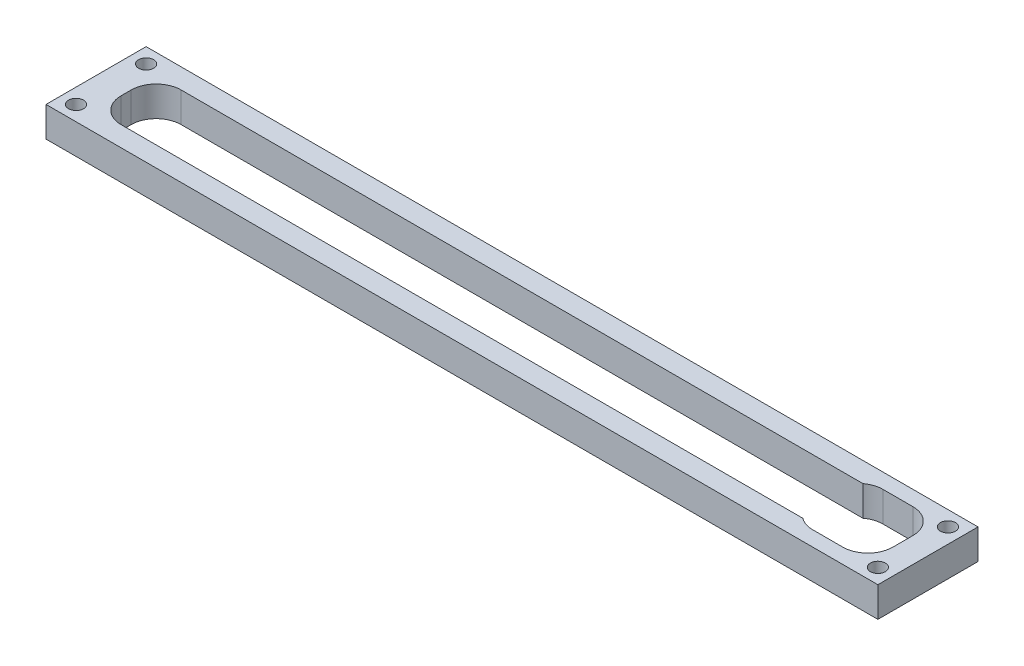
ISO-10303-21;
HEADER;
FILE_DESCRIPTION(('STEP AP214'),'2;1');
FILE_NAME('part.step','',(''),(''),'','','');
FILE_SCHEMA(('AUTOMOTIVE_DESIGN { 1 0 10303 214 1 1 1 1 }'));
ENDSEC;
DATA;
#1=APPLICATION_CONTEXT('core data for automotive mechanical design processes');
#2=APPLICATION_PROTOCOL_DEFINITION('international standard','automotive_design',2000,#1);
#3=PRODUCT_CONTEXT('',#1,'mechanical');
#4=PRODUCT('Part','Part','',(#3));
#5=PRODUCT_RELATED_PRODUCT_CATEGORY('part','',(#4));
#6=PRODUCT_DEFINITION_FORMATION('','',#4);
#7=PRODUCT_DEFINITION_CONTEXT('part definition',#1,'design');
#8=PRODUCT_DEFINITION('design','',#6,#7);
#9=PRODUCT_DEFINITION_SHAPE('','',#8);
#10=(LENGTH_UNIT() NAMED_UNIT(*) SI_UNIT(.MILLI.,.METRE.));
#11=(NAMED_UNIT(*) PLANE_ANGLE_UNIT() SI_UNIT($,.RADIAN.));
#12=(NAMED_UNIT(*) SI_UNIT($,.STERADIAN.) SOLID_ANGLE_UNIT());
#13=UNCERTAINTY_MEASURE_WITH_UNIT(LENGTH_MEASURE(1.E-05),#10,'distance_accuracy_value','');
#14=(GEOMETRIC_REPRESENTATION_CONTEXT(3) GLOBAL_UNCERTAINTY_ASSIGNED_CONTEXT((#13)) GLOBAL_UNIT_ASSIGNED_CONTEXT((#10,
#11,#12)) REPRESENTATION_CONTEXT('',''));
#15=CARTESIAN_POINT('',(0.,0.,0.));
#16=DIRECTION('',(0.,0.,1.));
#17=DIRECTION('',(1.,0.,0.));
#18=AXIS2_PLACEMENT_3D('',#15,#16,#17);
#19=CARTESIAN_POINT('',(0.,6.,0.));
#20=DIRECTION('',(0.,-1.,0.));
#21=DIRECTION('',(0.,0.,-1.));
#22=AXIS2_PLACEMENT_3D('',#19,#20,#21);
#23=PLANE('',#22);
#24=DIRECTION('',(0.,0.,1.));
#25=VECTOR('',#24,1.);
#26=CARTESIAN_POINT('',(0.,6.,0.));
#27=LINE('',#26,#25);
#28=CARTESIAN_POINT('',(0.,6.,-20.));
#29=VERTEX_POINT('',#28);
#30=CARTESIAN_POINT('',(0.,6.,0.));
#31=VERTEX_POINT('',#30);
#32=EDGE_CURVE('E250',#29,#31,#27,.T.);
#33=ORIENTED_EDGE('',*,*,#32,.T.);
#34=DIRECTION('',(1.,0.,0.));
#35=VECTOR('',#34,1.);
#36=CARTESIAN_POINT('',(0.,6.,0.));
#37=LINE('',#36,#35);
#38=CARTESIAN_POINT('',(166.159725664004,6.,0.));
#39=VERTEX_POINT('',#38);
#40=EDGE_CURVE('E253',#31,#39,#37,.T.);
#41=ORIENTED_EDGE('',*,*,#40,.T.);
#42=DIRECTION('',(0.,0.,-1.));
#43=VECTOR('',#42,1.);
#44=CARTESIAN_POINT('',(166.159725664004,6.,0.));
#45=LINE('',#44,#43);
#46=CARTESIAN_POINT('',(166.159725664004,6.,-20.));
#47=VERTEX_POINT('',#46);
#48=EDGE_CURVE('E256',#39,#47,#45,.T.);
#49=ORIENTED_EDGE('',*,*,#48,.T.);
#50=DIRECTION('',(-1.,0.,0.));
#51=VECTOR('',#50,1.);
#52=CARTESIAN_POINT('',(0.,6.,-20.));
#53=LINE('',#52,#51);
#54=EDGE_CURVE('E258',#47,#29,#53,.T.);
#55=ORIENTED_EDGE('',*,*,#54,.T.);
#56=EDGE_LOOP('',(#33,#41,#49,#55));
#57=FACE_BOUND('',#56,.T.);
#58=DIRECTION('',(-1.,0.,0.));
#59=VECTOR('',#58,1.);
#60=CARTESIAN_POINT('',(5.99999999999999,6.,-16.));
#61=LINE('',#60,#59);
#62=CARTESIAN_POINT('',(147.159725664004,6.,-16.));
#63=VERTEX_POINT('',#62);
#64=CARTESIAN_POINT('',(11.,6.,-16.));
#65=VERTEX_POINT('',#64);
#66=EDGE_CURVE('E243',#63,#65,#61,.T.);
#67=ORIENTED_EDGE('',*,*,#66,.F.);
#68=CARTESIAN_POINT('',(150.159725664004,6.,-12.));
#69=DIRECTION('',(0.,-1.,0.));
#70=DIRECTION('',(0.,0.,-1.));
#71=AXIS2_PLACEMENT_3D('',#68,#69,#70);
#72=CIRCLE('',#71,5.);
#73=CARTESIAN_POINT('',(150.159725664004,6.,-17.));
#74=VERTEX_POINT('',#73);
#75=EDGE_CURVE('E193',#63,#74,#72,.T.);
#76=ORIENTED_EDGE('',*,*,#75,.T.);
#77=DIRECTION('',(-1.,0.,0.));
#78=VECTOR('',#77,1.);
#79=CARTESIAN_POINT('',(147.159725664004,6.,-17.));
#80=LINE('',#79,#78);
#81=CARTESIAN_POINT('',(156.159725664004,6.,-17.));
#82=VERTEX_POINT('',#81);
#83=EDGE_CURVE('E205',#82,#74,#80,.T.);
#84=ORIENTED_EDGE('',*,*,#83,.F.);
#85=CARTESIAN_POINT('',(156.159725664004,6.,-12.));
#86=DIRECTION('',(0.,-1.,0.));
#87=DIRECTION('',(0.,0.,-1.));
#88=AXIS2_PLACEMENT_3D('',#85,#86,#87);
#89=CIRCLE('',#88,5.);
#90=CARTESIAN_POINT('',(161.159725664004,6.,-12.));
#91=VERTEX_POINT('',#90);
#92=EDGE_CURVE('E185',#82,#91,#89,.T.);
#93=ORIENTED_EDGE('',*,*,#92,.T.);
#94=DIRECTION('',(0.,0.,-1.));
#95=VECTOR('',#94,1.);
#96=CARTESIAN_POINT('',(161.159725664004,6.,-17.));
#97=LINE('',#96,#95);
#98=CARTESIAN_POINT('',(161.159725664004,6.,-8.00000000000001));
#99=VERTEX_POINT('',#98);
#100=EDGE_CURVE('E202',#99,#91,#97,.T.);
#101=ORIENTED_EDGE('',*,*,#100,.F.);
#102=CARTESIAN_POINT('',(156.159725664004,6.,-8.00000000000001));
#103=DIRECTION('',(0.,-1.,0.));
#104=DIRECTION('',(0.,0.,-1.));
#105=AXIS2_PLACEMENT_3D('',#102,#103,#104);
#106=CIRCLE('',#105,5.);
#107=CARTESIAN_POINT('',(156.159725664004,6.,-3.00000000000001));
#108=VERTEX_POINT('',#107);
#109=EDGE_CURVE('E189',#99,#108,#106,.T.);
#110=ORIENTED_EDGE('',*,*,#109,.T.);
#111=DIRECTION('',(1.,0.,0.));
#112=VECTOR('',#111,1.);
#113=CARTESIAN_POINT('',(147.159725664004,6.,-3.));
#114=LINE('',#113,#112);
#115=CARTESIAN_POINT('',(150.159725664004,6.,-3.));
#116=VERTEX_POINT('',#115);
#117=EDGE_CURVE('E200',#116,#108,#114,.T.);
#118=ORIENTED_EDGE('',*,*,#117,.F.);
#119=CARTESIAN_POINT('',(150.159725664004,6.,-8.00000000000001));
#120=DIRECTION('',(0.,-1.,0.));
#121=DIRECTION('',(0.,0.,-1.));
#122=AXIS2_PLACEMENT_3D('',#119,#120,#121);
#123=CIRCLE('',#122,5.);
#124=CARTESIAN_POINT('',(147.159725664004,6.,-4.00000000000002));
#125=VERTEX_POINT('',#124);
#126=EDGE_CURVE('E43',#116,#125,#123,.T.);
#127=ORIENTED_EDGE('',*,*,#126,.T.);
#128=DIRECTION('',(1.,0.,0.));
#129=VECTOR('',#128,1.);
#130=CARTESIAN_POINT('',(5.99999999999999,6.,-4.00000000000002));
#131=LINE('',#130,#129);
#132=CARTESIAN_POINT('',(11.,6.,-4.00000000000002));
#133=VERTEX_POINT('',#132);
#134=EDGE_CURVE('E162',#133,#125,#131,.T.);
#135=ORIENTED_EDGE('',*,*,#134,.F.);
#136=CARTESIAN_POINT('',(11.,6.,-9.00000000000001));
#137=DIRECTION('',(0.,-1.,0.));
#138=DIRECTION('',(0.,0.,-1.));
#139=AXIS2_PLACEMENT_3D('',#136,#137,#138);
#140=CIRCLE('',#139,5.);
#141=CARTESIAN_POINT('',(5.99999999999999,6.,-9.00000000000001));
#142=VERTEX_POINT('',#141);
#143=EDGE_CURVE('E179',#133,#142,#140,.T.);
#144=ORIENTED_EDGE('',*,*,#143,.T.);
#145=DIRECTION('',(0.,0.,1.));
#146=VECTOR('',#145,1.);
#147=CARTESIAN_POINT('',(5.99999999999999,6.,-16.));
#148=LINE('',#147,#146);
#149=CARTESIAN_POINT('',(5.99999999999999,6.,-11.));
#150=VERTEX_POINT('',#149);
#151=EDGE_CURVE('E239',#150,#142,#148,.T.);
#152=ORIENTED_EDGE('',*,*,#151,.F.);
#153=CARTESIAN_POINT('',(11.,6.,-11.));
#154=DIRECTION('',(0.,-1.,0.));
#155=DIRECTION('',(0.,0.,-1.));
#156=AXIS2_PLACEMENT_3D('',#153,#154,#155);
#157=CIRCLE('',#156,5.);
#158=EDGE_CURVE('E183',#150,#65,#157,.T.);
#159=ORIENTED_EDGE('',*,*,#158,.T.);
#160=EDGE_LOOP('',(#67,#76,#84,#93,#101,#110,#118,#127,#135,#144,#152,#159));
#161=FACE_BOUND('',#160,.T.);
#162=CARTESIAN_POINT('',(3.,6.,-17.));
#163=DIRECTION('',(0.,1.,0.));
#164=DIRECTION('',(0.,0.,1.));
#165=AXIS2_PLACEMENT_3D('',#162,#163,#164);
#166=CIRCLE('',#165,1.5);
#167=CARTESIAN_POINT('',(3.,6.,-15.5));
#168=VERTEX_POINT('',#167);
#169=EDGE_CURVE('E234',#168,#168,#166,.T.);
#170=ORIENTED_EDGE('',*,*,#169,.F.);
#171=EDGE_LOOP('',(#170));
#172=FACE_BOUND('',#171,.T.);
#173=CARTESIAN_POINT('',(3.,6.,-3.));
#174=DIRECTION('',(0.,1.,0.));
#175=DIRECTION('',(0.,0.,-1.));
#176=AXIS2_PLACEMENT_3D('',#173,#174,#175);
#177=CIRCLE('',#176,1.5);
#178=CARTESIAN_POINT('',(3.,6.,-4.5));
#179=VERTEX_POINT('',#178);
#180=EDGE_CURVE('E228',#179,#179,#177,.T.);
#181=ORIENTED_EDGE('',*,*,#180,.F.);
#182=EDGE_LOOP('',(#181));
#183=FACE_BOUND('',#182,.T.);
#184=CARTESIAN_POINT('',(163.159725664004,6.,-3.00000000000002));
#185=DIRECTION('',(0.,1.,0.));
#186=DIRECTION('',(0.,0.,1.));
#187=AXIS2_PLACEMENT_3D('',#184,#185,#186);
#188=CIRCLE('',#187,1.5);
#189=CARTESIAN_POINT('',(163.159725664004,6.,-1.50000000000002));
#190=VERTEX_POINT('',#189);
#191=EDGE_CURVE('E222',#190,#190,#188,.T.);
#192=ORIENTED_EDGE('',*,*,#191,.F.);
#193=EDGE_LOOP('',(#192));
#194=FACE_BOUND('',#193,.T.);
#195=CARTESIAN_POINT('',(163.159725664004,6.,-17.0000000000001));
#196=DIRECTION('',(0.,1.,0.));
#197=DIRECTION('',(0.,0.,-1.));
#198=AXIS2_PLACEMENT_3D('',#195,#196,#197);
#199=CIRCLE('',#198,1.5);
#200=CARTESIAN_POINT('',(163.159725664004,6.,-18.5000000000001));
#201=VERTEX_POINT('',#200);
#202=EDGE_CURVE('E216',#201,#201,#199,.T.);
#203=ORIENTED_EDGE('',*,*,#202,.F.);
#204=EDGE_LOOP('',(#203));
#205=FACE_BOUND('',#204,.T.);
#206=ADVANCED_FACE('F35',(#57,#161,#172,#183,#194,#205),#23,.F.);
#207=CARTESIAN_POINT('',(0.,0.,0.));
#208=DIRECTION('',(0.,-1.,0.));
#209=DIRECTION('',(0.,0.,-1.));
#210=AXIS2_PLACEMENT_3D('',#207,#208,#209);
#211=PLANE('',#210);
#212=DIRECTION('',(-1.,0.,0.));
#213=VECTOR('',#212,1.);
#214=CARTESIAN_POINT('',(147.159725664004,0.,-17.));
#215=LINE('',#214,#213);
#216=CARTESIAN_POINT('',(156.159725664004,0.,-17.));
#217=VERTEX_POINT('',#216);
#218=CARTESIAN_POINT('',(150.159725664004,0.,-17.));
#219=VERTEX_POINT('',#218);
#220=EDGE_CURVE('E165',#217,#219,#215,.T.);
#221=ORIENTED_EDGE('',*,*,#220,.T.);
#222=CARTESIAN_POINT('',(150.159725664004,0.,-12.));
#223=DIRECTION('',(0.,-1.,0.));
#224=DIRECTION('',(0.,0.,-1.));
#225=AXIS2_PLACEMENT_3D('',#222,#223,#224);
#226=CIRCLE('',#225,5.);
#227=CARTESIAN_POINT('',(147.159725664004,0.,-16.));
#228=VERTEX_POINT('',#227);
#229=EDGE_CURVE('E195',#219,#228,#226,.F.);
#230=ORIENTED_EDGE('',*,*,#229,.T.);
#231=DIRECTION('',(-1.,0.,0.));
#232=VECTOR('',#231,1.);
#233=CARTESIAN_POINT('',(5.99999999999999,0.,-16.));
#234=LINE('',#233,#232);
#235=CARTESIAN_POINT('',(11.,0.,-16.));
#236=VERTEX_POINT('',#235);
#237=EDGE_CURVE('E154',#228,#236,#234,.T.);
#238=ORIENTED_EDGE('',*,*,#237,.T.);
#239=CARTESIAN_POINT('',(11.,0.,-11.));
#240=DIRECTION('',(0.,-1.,0.));
#241=DIRECTION('',(0.,0.,-1.));
#242=AXIS2_PLACEMENT_3D('',#239,#240,#241);
#243=CIRCLE('',#242,5.);
#244=CARTESIAN_POINT('',(5.99999999999999,0.,-11.));
#245=VERTEX_POINT('',#244);
#246=EDGE_CURVE('E181',#236,#245,#243,.F.);
#247=ORIENTED_EDGE('',*,*,#246,.T.);
#248=DIRECTION('',(0.,0.,1.));
#249=VECTOR('',#248,1.);
#250=CARTESIAN_POINT('',(5.99999999999999,0.,-16.));
#251=LINE('',#250,#249);
#252=CARTESIAN_POINT('',(5.99999999999999,0.,-9.00000000000001));
#253=VERTEX_POINT('',#252);
#254=EDGE_CURVE('E155',#245,#253,#251,.T.);
#255=ORIENTED_EDGE('',*,*,#254,.T.);
#256=CARTESIAN_POINT('',(11.,0.,-9.00000000000001));
#257=DIRECTION('',(0.,-1.,0.));
#258=DIRECTION('',(0.,0.,-1.));
#259=AXIS2_PLACEMENT_3D('',#256,#257,#258);
#260=CIRCLE('',#259,5.);
#261=CARTESIAN_POINT('',(11.,0.,-4.00000000000002));
#262=VERTEX_POINT('',#261);
#263=EDGE_CURVE('E151',#253,#262,#260,.F.);
#264=ORIENTED_EDGE('',*,*,#263,.T.);
#265=DIRECTION('',(1.,0.,0.));
#266=VECTOR('',#265,1.);
#267=CARTESIAN_POINT('',(5.99999999999999,0.,-4.00000000000002));
#268=LINE('',#267,#266);
#269=CARTESIAN_POINT('',(147.159725664004,0.,-4.00000000000002));
#270=VERTEX_POINT('',#269);
#271=EDGE_CURVE('E145',#262,#270,#268,.T.);
#272=ORIENTED_EDGE('',*,*,#271,.T.);
#273=CARTESIAN_POINT('',(150.159725664004,0.,-8.00000000000001));
#274=DIRECTION('',(0.,-1.,0.));
#275=DIRECTION('',(0.,0.,-1.));
#276=AXIS2_PLACEMENT_3D('',#273,#274,#275);
#277=CIRCLE('',#276,5.);
#278=CARTESIAN_POINT('',(150.159725664004,0.,-3.));
#279=VERTEX_POINT('',#278);
#280=EDGE_CURVE('E11',#270,#279,#277,.F.);
#281=ORIENTED_EDGE('',*,*,#280,.T.);
#282=DIRECTION('',(1.,0.,0.));
#283=VECTOR('',#282,1.);
#284=CARTESIAN_POINT('',(147.159725664004,0.,-3.));
#285=LINE('',#284,#283);
#286=CARTESIAN_POINT('',(156.159725664004,0.,-3.00000000000001));
#287=VERTEX_POINT('',#286);
#288=EDGE_CURVE('E212',#279,#287,#285,.T.);
#289=ORIENTED_EDGE('',*,*,#288,.T.);
#290=CARTESIAN_POINT('',(156.159725664004,0.,-8.00000000000001));
#291=DIRECTION('',(0.,-1.,0.));
#292=DIRECTION('',(0.,0.,-1.));
#293=AXIS2_PLACEMENT_3D('',#290,#291,#292);
#294=CIRCLE('',#293,5.);
#295=CARTESIAN_POINT('',(161.159725664004,0.,-8.00000000000001));
#296=VERTEX_POINT('',#295);
#297=EDGE_CURVE('E191',#287,#296,#294,.F.);
#298=ORIENTED_EDGE('',*,*,#297,.T.);
#299=DIRECTION('',(0.,0.,-1.));
#300=VECTOR('',#299,1.);
#301=CARTESIAN_POINT('',(161.159725664004,0.,-17.));
#302=LINE('',#301,#300);
#303=CARTESIAN_POINT('',(161.159725664004,0.,-12.));
#304=VERTEX_POINT('',#303);
#305=EDGE_CURVE('E300',#296,#304,#302,.T.);
#306=ORIENTED_EDGE('',*,*,#305,.T.);
#307=CARTESIAN_POINT('',(156.159725664004,0.,-12.));
#308=DIRECTION('',(0.,-1.,0.));
#309=DIRECTION('',(0.,0.,-1.));
#310=AXIS2_PLACEMENT_3D('',#307,#308,#309);
#311=CIRCLE('',#310,5.);
#312=EDGE_CURVE('E187',#304,#217,#311,.F.);
#313=ORIENTED_EDGE('',*,*,#312,.T.);
#314=EDGE_LOOP('',(#221,#230,#238,#247,#255,#264,#272,#281,#289,#298,#306,#313));
#315=FACE_BOUND('',#314,.T.);
#316=CARTESIAN_POINT('',(163.159725664004,0.,-3.00000000000002));
#317=DIRECTION('',(0.,1.,0.));
#318=DIRECTION('',(0.,0.,1.));
#319=AXIS2_PLACEMENT_3D('',#316,#317,#318);
#320=CIRCLE('',#319,1.5);
#321=CARTESIAN_POINT('',(163.159725664004,0.,-1.50000000000002));
#322=VERTEX_POINT('',#321);
#323=EDGE_CURVE('E219',#322,#322,#320,.T.);
#324=ORIENTED_EDGE('',*,*,#323,.T.);
#325=EDGE_LOOP('',(#324));
#326=FACE_BOUND('',#325,.T.);
#327=CARTESIAN_POINT('',(3.,0.,-17.));
#328=DIRECTION('',(0.,1.,0.));
#329=DIRECTION('',(0.,0.,1.));
#330=AXIS2_PLACEMENT_3D('',#327,#328,#329);
#331=CIRCLE('',#330,1.5);
#332=CARTESIAN_POINT('',(3.,0.,-15.5));
#333=VERTEX_POINT('',#332);
#334=EDGE_CURVE('E231',#333,#333,#331,.T.);
#335=ORIENTED_EDGE('',*,*,#334,.T.);
#336=EDGE_LOOP('',(#335));
#337=FACE_BOUND('',#336,.T.);
#338=DIRECTION('',(0.,0.,1.));
#339=VECTOR('',#338,1.);
#340=CARTESIAN_POINT('',(0.,0.,0.));
#341=LINE('',#340,#339);
#342=CARTESIAN_POINT('',(0.,0.,-20.));
#343=VERTEX_POINT('',#342);
#344=CARTESIAN_POINT('',(0.,0.,0.));
#345=VERTEX_POINT('',#344);
#346=EDGE_CURVE('E246',#343,#345,#341,.T.);
#347=ORIENTED_EDGE('',*,*,#346,.F.);
#348=DIRECTION('',(-1.,0.,0.));
#349=VECTOR('',#348,1.);
#350=CARTESIAN_POINT('',(0.,0.,-20.));
#351=LINE('',#350,#349);
#352=CARTESIAN_POINT('',(166.159725664004,0.,-20.));
#353=VERTEX_POINT('',#352);
#354=EDGE_CURVE('E254',#353,#343,#351,.T.);
#355=ORIENTED_EDGE('',*,*,#354,.F.);
#356=DIRECTION('',(0.,0.,-1.));
#357=VECTOR('',#356,1.);
#358=CARTESIAN_POINT('',(166.159725664004,0.,0.));
#359=LINE('',#358,#357);
#360=CARTESIAN_POINT('',(166.159725664004,0.,0.));
#361=VERTEX_POINT('',#360);
#362=EDGE_CURVE('E265',#361,#353,#359,.T.);
#363=ORIENTED_EDGE('',*,*,#362,.F.);
#364=DIRECTION('',(1.,0.,0.));
#365=VECTOR('',#364,1.);
#366=CARTESIAN_POINT('',(0.,0.,0.));
#367=LINE('',#366,#365);
#368=EDGE_CURVE('E263',#345,#361,#367,.T.);
#369=ORIENTED_EDGE('',*,*,#368,.F.);
#370=EDGE_LOOP('',(#347,#355,#363,#369));
#371=FACE_BOUND('',#370,.T.);
#372=CARTESIAN_POINT('',(3.,0.,-3.));
#373=DIRECTION('',(0.,1.,0.));
#374=DIRECTION('',(0.,0.,-1.));
#375=AXIS2_PLACEMENT_3D('',#372,#373,#374);
#376=CIRCLE('',#375,1.5);
#377=CARTESIAN_POINT('',(3.,0.,-4.5));
#378=VERTEX_POINT('',#377);
#379=EDGE_CURVE('E225',#378,#378,#376,.T.);
#380=ORIENTED_EDGE('',*,*,#379,.T.);
#381=EDGE_LOOP('',(#380));
#382=FACE_BOUND('',#381,.T.);
#383=CARTESIAN_POINT('',(163.159725664004,0.,-17.0000000000001));
#384=DIRECTION('',(0.,1.,0.));
#385=DIRECTION('',(0.,0.,-1.));
#386=AXIS2_PLACEMENT_3D('',#383,#384,#385);
#387=CIRCLE('',#386,1.5);
#388=CARTESIAN_POINT('',(163.159725664004,0.,-18.5000000000001));
#389=VERTEX_POINT('',#388);
#390=EDGE_CURVE('E214',#389,#389,#387,.T.);
#391=ORIENTED_EDGE('',*,*,#390,.T.);
#392=EDGE_LOOP('',(#391));
#393=FACE_BOUND('',#392,.T.);
#394=ADVANCED_FACE('F148',(#315,#326,#337,#371,#382,#393),#211,.T.);
#395=CARTESIAN_POINT('',(0.,6.,0.));
#396=DIRECTION('',(1.,0.,0.));
#397=DIRECTION('',(0.,0.,-1.));
#398=AXIS2_PLACEMENT_3D('',#395,#396,#397);
#399=PLANE('',#398);
#400=ORIENTED_EDGE('',*,*,#346,.T.);
#401=DIRECTION('',(0.,-1.,0.));
#402=VECTOR('',#401,1.);
#403=CARTESIAN_POINT('',(0.,6.,0.));
#404=LINE('',#403,#402);
#405=EDGE_CURVE('E276',#31,#345,#404,.T.);
#406=ORIENTED_EDGE('',*,*,#405,.F.);
#407=ORIENTED_EDGE('',*,*,#32,.F.);
#408=DIRECTION('',(0.,-1.,0.));
#409=VECTOR('',#408,1.);
#410=CARTESIAN_POINT('',(0.,6.,-20.));
#411=LINE('',#410,#409);
#412=EDGE_CURVE('E260',#29,#343,#411,.T.);
#413=ORIENTED_EDGE('',*,*,#412,.T.);
#414=EDGE_LOOP('',(#400,#406,#407,#413));
#415=FACE_BOUND('',#414,.T.);
#416=ADVANCED_FACE('F331',(#415),#399,.F.);
#417=CARTESIAN_POINT('',(0.,6.,0.));
#418=DIRECTION('',(0.,0.,-1.));
#419=DIRECTION('',(-1.,0.,0.));
#420=AXIS2_PLACEMENT_3D('',#417,#418,#419);
#421=PLANE('',#420);
#422=ORIENTED_EDGE('',*,*,#368,.T.);
#423=DIRECTION('',(0.,-1.,0.));
#424=VECTOR('',#423,1.);
#425=CARTESIAN_POINT('',(166.159725664004,6.,0.));
#426=LINE('',#425,#424);
#427=EDGE_CURVE('E273',#39,#361,#426,.T.);
#428=ORIENTED_EDGE('',*,*,#427,.F.);
#429=ORIENTED_EDGE('',*,*,#40,.F.);
#430=ORIENTED_EDGE('',*,*,#405,.T.);
#431=EDGE_LOOP('',(#422,#428,#429,#430));
#432=FACE_BOUND('',#431,.T.);
#433=ADVANCED_FACE('F344',(#432),#421,.F.);
#434=CARTESIAN_POINT('',(166.159725664004,6.,0.));
#435=DIRECTION('',(-1.,0.,0.));
#436=DIRECTION('',(0.,0.,1.));
#437=AXIS2_PLACEMENT_3D('',#434,#435,#436);
#438=PLANE('',#437);
#439=ORIENTED_EDGE('',*,*,#362,.T.);
#440=DIRECTION('',(0.,-1.,0.));
#441=VECTOR('',#440,1.);
#442=CARTESIAN_POINT('',(166.159725664004,6.,-20.));
#443=LINE('',#442,#441);
#444=EDGE_CURVE('E270',#47,#353,#443,.T.);
#445=ORIENTED_EDGE('',*,*,#444,.F.);
#446=ORIENTED_EDGE('',*,*,#48,.F.);
#447=ORIENTED_EDGE('',*,*,#427,.T.);
#448=EDGE_LOOP('',(#439,#445,#446,#447));
#449=FACE_BOUND('',#448,.T.);
#450=ADVANCED_FACE('F340',(#449),#438,.F.);
#451=CARTESIAN_POINT('',(0.,6.,-20.));
#452=DIRECTION('',(0.,0.,1.));
#453=DIRECTION('',(1.,0.,0.));
#454=AXIS2_PLACEMENT_3D('',#451,#452,#453);
#455=PLANE('',#454);
#456=ORIENTED_EDGE('',*,*,#354,.T.);
#457=ORIENTED_EDGE('',*,*,#412,.F.);
#458=ORIENTED_EDGE('',*,*,#54,.F.);
#459=ORIENTED_EDGE('',*,*,#444,.T.);
#460=EDGE_LOOP('',(#456,#457,#458,#459));
#461=FACE_BOUND('',#460,.T.);
#462=ADVANCED_FACE('F337',(#461),#455,.F.);
#463=CARTESIAN_POINT('',(5.99999999999999,6.,-16.));
#464=DIRECTION('',(1.,0.,0.));
#465=DIRECTION('',(0.,0.,-1.));
#466=AXIS2_PLACEMENT_3D('',#463,#464,#465);
#467=PLANE('',#466);
#468=ORIENTED_EDGE('',*,*,#151,.T.);
#469=DIRECTION('',(0.,-1.,0.));
#470=VECTOR('',#469,1.);
#471=CARTESIAN_POINT('',(5.99999999999999,0.,-9.00000000000001));
#472=LINE('',#471,#470);
#473=EDGE_CURVE('E281',#142,#253,#472,.T.);
#474=ORIENTED_EDGE('',*,*,#473,.T.);
#475=ORIENTED_EDGE('',*,*,#254,.F.);
#476=DIRECTION('',(0.,-1.,0.));
#477=VECTOR('',#476,1.);
#478=CARTESIAN_POINT('',(5.99999999999999,6.,-11.));
#479=LINE('',#478,#477);
#480=EDGE_CURVE('E279',#245,#150,#479,.F.);
#481=ORIENTED_EDGE('',*,*,#480,.T.);
#482=EDGE_LOOP('',(#468,#474,#475,#481));
#483=FACE_BOUND('',#482,.T.);
#484=ADVANCED_FACE('F334',(#483),#467,.T.);
#485=CARTESIAN_POINT('',(5.99999999999999,6.,-4.00000000000002));
#486=DIRECTION('',(0.,0.,-1.));
#487=DIRECTION('',(-1.,0.,0.));
#488=AXIS2_PLACEMENT_3D('',#485,#486,#487);
#489=PLANE('',#488);
#490=ORIENTED_EDGE('',*,*,#271,.F.);
#491=DIRECTION('',(0.,-1.,0.));
#492=VECTOR('',#491,1.);
#493=CARTESIAN_POINT('',(11.,6.,-4.00000000000002));
#494=LINE('',#493,#492);
#495=EDGE_CURVE('E284',#262,#133,#494,.F.);
#496=ORIENTED_EDGE('',*,*,#495,.T.);
#497=ORIENTED_EDGE('',*,*,#134,.T.);
#498=DIRECTION('',(0.,1.,0.));
#499=VECTOR('',#498,1.);
#500=CARTESIAN_POINT('',(147.159725664004,0.,-4.00000000000002));
#501=LINE('',#500,#499);
#502=EDGE_CURVE('E159',#270,#125,#501,.T.);
#503=ORIENTED_EDGE('',*,*,#502,.F.);
#504=EDGE_LOOP('',(#490,#496,#497,#503));
#505=FACE_BOUND('',#504,.T.);
#506=ADVANCED_FACE('F160',(#505),#489,.T.);
#507=CARTESIAN_POINT('',(5.99999999999999,6.,-16.));
#508=DIRECTION('',(0.,0.,1.));
#509=DIRECTION('',(1.,0.,0.));
#510=AXIS2_PLACEMENT_3D('',#507,#508,#509);
#511=PLANE('',#510);
#512=ORIENTED_EDGE('',*,*,#66,.T.);
#513=DIRECTION('',(0.,-1.,0.));
#514=VECTOR('',#513,1.);
#515=CARTESIAN_POINT('',(11.,0.,-16.));
#516=LINE('',#515,#514);
#517=EDGE_CURVE('E286',#65,#236,#516,.T.);
#518=ORIENTED_EDGE('',*,*,#517,.T.);
#519=ORIENTED_EDGE('',*,*,#237,.F.);
#520=DIRECTION('',(0.,1.,0.));
#521=VECTOR('',#520,1.);
#522=CARTESIAN_POINT('',(147.159725664004,0.,-16.));
#523=LINE('',#522,#521);
#524=EDGE_CURVE('E164',#228,#63,#523,.T.);
#525=ORIENTED_EDGE('',*,*,#524,.T.);
#526=EDGE_LOOP('',(#512,#518,#519,#525));
#527=FACE_BOUND('',#526,.T.);
#528=ADVANCED_FACE('F366',(#527),#511,.T.);
#529=CARTESIAN_POINT('',(3.,6.,-17.));
#530=DIRECTION('',(0.,-1.,0.));
#531=DIRECTION('',(0.,0.,-1.));
#532=AXIS2_PLACEMENT_3D('',#529,#530,#531);
#533=CYLINDRICAL_SURFACE('',#532,1.5);
#534=ORIENTED_EDGE('',*,*,#169,.T.);
#535=EDGE_LOOP('',(#534));
#536=FACE_BOUND('',#535,.T.);
#537=ORIENTED_EDGE('',*,*,#334,.F.);
#538=EDGE_LOOP('',(#537));
#539=FACE_BOUND('',#538,.T.);
#540=ADVANCED_FACE('F379',(#536,#539),#533,.F.);
#541=CARTESIAN_POINT('',(3.,6.,-3.));
#542=DIRECTION('',(0.,-1.,0.));
#543=DIRECTION('',(0.,0.,-1.));
#544=AXIS2_PLACEMENT_3D('',#541,#542,#543);
#545=CYLINDRICAL_SURFACE('',#544,1.5);
#546=ORIENTED_EDGE('',*,*,#180,.T.);
#547=EDGE_LOOP('',(#546));
#548=FACE_BOUND('',#547,.T.);
#549=ORIENTED_EDGE('',*,*,#379,.F.);
#550=EDGE_LOOP('',(#549));
#551=FACE_BOUND('',#550,.T.);
#552=ADVANCED_FACE('F384',(#548,#551),#545,.F.);
#553=CARTESIAN_POINT('',(163.159725664004,6.,-3.00000000000002));
#554=DIRECTION('',(0.,-1.,0.));
#555=DIRECTION('',(0.,0.,-1.));
#556=AXIS2_PLACEMENT_3D('',#553,#554,#555);
#557=CYLINDRICAL_SURFACE('',#556,1.5);
#558=ORIENTED_EDGE('',*,*,#191,.T.);
#559=EDGE_LOOP('',(#558));
#560=FACE_BOUND('',#559,.T.);
#561=ORIENTED_EDGE('',*,*,#323,.F.);
#562=EDGE_LOOP('',(#561));
#563=FACE_BOUND('',#562,.T.);
#564=ADVANCED_FACE('F388',(#560,#563),#557,.F.);
#565=CARTESIAN_POINT('',(163.159725664004,6.,-17.0000000000001));
#566=DIRECTION('',(0.,-1.,0.));
#567=DIRECTION('',(0.,0.,-1.));
#568=AXIS2_PLACEMENT_3D('',#565,#566,#567);
#569=CYLINDRICAL_SURFACE('',#568,1.5);
#570=ORIENTED_EDGE('',*,*,#202,.T.);
#571=EDGE_LOOP('',(#570));
#572=FACE_BOUND('',#571,.T.);
#573=ORIENTED_EDGE('',*,*,#390,.F.);
#574=EDGE_LOOP('',(#573));
#575=FACE_BOUND('',#574,.T.);
#576=ADVANCED_FACE('F392',(#572,#575),#569,.F.);
#577=CARTESIAN_POINT('',(147.159725664004,0.,-17.));
#578=DIRECTION('',(0.,0.,-1.));
#579=DIRECTION('',(-1.,0.,0.));
#580=AXIS2_PLACEMENT_3D('',#577,#578,#579);
#581=PLANE('',#580);
#582=ORIENTED_EDGE('',*,*,#220,.F.);
#583=DIRECTION('',(0.,1.,0.));
#584=VECTOR('',#583,1.);
#585=CARTESIAN_POINT('',(156.159725664004,6.,-17.));
#586=LINE('',#585,#584);
#587=EDGE_CURVE('E291',#217,#82,#586,.T.);
#588=ORIENTED_EDGE('',*,*,#587,.T.);
#589=ORIENTED_EDGE('',*,*,#83,.T.);
#590=DIRECTION('',(0.,1.,0.));
#591=VECTOR('',#590,1.);
#592=CARTESIAN_POINT('',(150.159725664004,0.,-17.));
#593=LINE('',#592,#591);
#594=EDGE_CURVE('E289',#74,#219,#593,.F.);
#595=ORIENTED_EDGE('',*,*,#594,.T.);
#596=EDGE_LOOP('',(#582,#588,#589,#595));
#597=FACE_BOUND('',#596,.T.);
#598=ADVANCED_FACE('F310',(#597),#581,.F.);
#599=CARTESIAN_POINT('',(161.159725664004,0.,-17.));
#600=DIRECTION('',(1.,0.,0.));
#601=DIRECTION('',(0.,0.,-1.));
#602=AXIS2_PLACEMENT_3D('',#599,#600,#601);
#603=PLANE('',#602);
#604=ORIENTED_EDGE('',*,*,#100,.T.);
#605=DIRECTION('',(0.,1.,0.));
#606=VECTOR('',#605,1.);
#607=CARTESIAN_POINT('',(161.159725664004,0.,-12.));
#608=LINE('',#607,#606);
#609=EDGE_CURVE('E171',#91,#304,#608,.F.);
#610=ORIENTED_EDGE('',*,*,#609,.T.);
#611=ORIENTED_EDGE('',*,*,#305,.F.);
#612=DIRECTION('',(0.,1.,0.));
#613=VECTOR('',#612,1.);
#614=CARTESIAN_POINT('',(161.159725664004,6.,-8.00000000000001));
#615=LINE('',#614,#613);
#616=EDGE_CURVE('E174',#296,#99,#615,.T.);
#617=ORIENTED_EDGE('',*,*,#616,.T.);
#618=EDGE_LOOP('',(#604,#610,#611,#617));
#619=FACE_BOUND('',#618,.T.);
#620=ADVANCED_FACE('F297',(#619),#603,.F.);
#621=CARTESIAN_POINT('',(147.159725664004,0.,-3.));
#622=DIRECTION('',(0.,0.,1.));
#623=DIRECTION('',(1.,0.,0.));
#624=AXIS2_PLACEMENT_3D('',#621,#622,#623);
#625=PLANE('',#624);
#626=ORIENTED_EDGE('',*,*,#117,.T.);
#627=DIRECTION('',(0.,1.,0.));
#628=VECTOR('',#627,1.);
#629=CARTESIAN_POINT('',(156.159725664004,0.,-3.00000000000001));
#630=LINE('',#629,#628);
#631=EDGE_CURVE('E50',#108,#287,#630,.F.);
#632=ORIENTED_EDGE('',*,*,#631,.T.);
#633=ORIENTED_EDGE('',*,*,#288,.F.);
#634=DIRECTION('',(0.,-1.,0.));
#635=VECTOR('',#634,1.);
#636=CARTESIAN_POINT('',(150.159725664004,0.,-3.));
#637=LINE('',#636,#635);
#638=EDGE_CURVE('E169',#279,#116,#637,.F.);
#639=ORIENTED_EDGE('',*,*,#638,.T.);
#640=EDGE_LOOP('',(#626,#632,#633,#639));
#641=FACE_BOUND('',#640,.T.);
#642=ADVANCED_FACE('F355',(#641),#625,.F.);
#643=CARTESIAN_POINT('',(11.,6.,-9.00000000000001));
#644=DIRECTION('',(0.,1.,0.));
#645=DIRECTION('',(0.,0.,1.));
#646=AXIS2_PLACEMENT_3D('',#643,#644,#645);
#647=CYLINDRICAL_SURFACE('',#646,5.);
#648=ORIENTED_EDGE('',*,*,#143,.F.);
#649=ORIENTED_EDGE('',*,*,#495,.F.);
#650=ORIENTED_EDGE('',*,*,#263,.F.);
#651=ORIENTED_EDGE('',*,*,#473,.F.);
#652=EDGE_LOOP('',(#648,#649,#650,#651));
#653=FACE_BOUND('',#652,.T.);
#654=ADVANCED_FACE('F352',(#653),#647,.F.);
#655=CARTESIAN_POINT('',(11.,6.,-11.));
#656=DIRECTION('',(0.,1.,0.));
#657=DIRECTION('',(0.,0.,1.));
#658=AXIS2_PLACEMENT_3D('',#655,#656,#657);
#659=CYLINDRICAL_SURFACE('',#658,5.);
#660=ORIENTED_EDGE('',*,*,#158,.F.);
#661=ORIENTED_EDGE('',*,*,#480,.F.);
#662=ORIENTED_EDGE('',*,*,#246,.F.);
#663=ORIENTED_EDGE('',*,*,#517,.F.);
#664=EDGE_LOOP('',(#660,#661,#662,#663));
#665=FACE_BOUND('',#664,.T.);
#666=ADVANCED_FACE('F323',(#665),#659,.F.);
#667=CARTESIAN_POINT('',(156.159725664004,0.,-12.));
#668=DIRECTION('',(0.,-1.,0.));
#669=DIRECTION('',(0.,0.,-1.));
#670=AXIS2_PLACEMENT_3D('',#667,#668,#669);
#671=CYLINDRICAL_SURFACE('',#670,5.);
#672=ORIENTED_EDGE('',*,*,#312,.F.);
#673=ORIENTED_EDGE('',*,*,#609,.F.);
#674=ORIENTED_EDGE('',*,*,#92,.F.);
#675=ORIENTED_EDGE('',*,*,#587,.F.);
#676=EDGE_LOOP('',(#672,#673,#674,#675));
#677=FACE_BOUND('',#676,.T.);
#678=ADVANCED_FACE('F307',(#677),#671,.F.);
#679=CARTESIAN_POINT('',(156.159725664004,0.,-8.00000000000001));
#680=DIRECTION('',(0.,-1.,0.));
#681=DIRECTION('',(0.,0.,-1.));
#682=AXIS2_PLACEMENT_3D('',#679,#680,#681);
#683=CYLINDRICAL_SURFACE('',#682,5.);
#684=ORIENTED_EDGE('',*,*,#297,.F.);
#685=ORIENTED_EDGE('',*,*,#631,.F.);
#686=ORIENTED_EDGE('',*,*,#109,.F.);
#687=ORIENTED_EDGE('',*,*,#616,.F.);
#688=EDGE_LOOP('',(#684,#685,#686,#687));
#689=FACE_BOUND('',#688,.T.);
#690=ADVANCED_FACE('F314',(#689),#683,.F.);
#691=CARTESIAN_POINT('',(150.159725664004,0.,-12.));
#692=DIRECTION('',(0.,1.,0.));
#693=DIRECTION('',(0.,0.,1.));
#694=AXIS2_PLACEMENT_3D('',#691,#692,#693);
#695=CYLINDRICAL_SURFACE('',#694,5.);
#696=ORIENTED_EDGE('',*,*,#229,.F.);
#697=ORIENTED_EDGE('',*,*,#594,.F.);
#698=ORIENTED_EDGE('',*,*,#75,.F.);
#699=ORIENTED_EDGE('',*,*,#524,.F.);
#700=EDGE_LOOP('',(#696,#697,#698,#699));
#701=FACE_BOUND('',#700,.T.);
#702=ADVANCED_FACE('F316',(#701),#695,.F.);
#703=CARTESIAN_POINT('',(150.159725664004,0.,-8.00000000000001));
#704=DIRECTION('',(0.,-1.,0.));
#705=DIRECTION('',(0.,0.,-1.));
#706=AXIS2_PLACEMENT_3D('',#703,#704,#705);
#707=CYLINDRICAL_SURFACE('',#706,5.);
#708=ORIENTED_EDGE('',*,*,#280,.F.);
#709=ORIENTED_EDGE('',*,*,#502,.T.);
#710=ORIENTED_EDGE('',*,*,#126,.F.);
#711=ORIENTED_EDGE('',*,*,#638,.F.);
#712=EDGE_LOOP('',(#708,#709,#710,#711));
#713=FACE_BOUND('',#712,.T.);
#714=ADVANCED_FACE('F37',(#713),#707,.F.);
#715=CLOSED_SHELL('',(#206,#394,#416,#433,#450,#462,#484,#506,#528,#540,#552,#564,#576,#598,
#620,#642,#654,#666,#678,#690,#702,#714));
#716=MANIFOLD_SOLID_BREP('B2',#715);
#717=ADVANCED_BREP_SHAPE_REPRESENTATION('',(#18,#716),#14);
#718=SHAPE_DEFINITION_REPRESENTATION(#9,#717);
ENDSEC;
END-ISO-10303-21;
